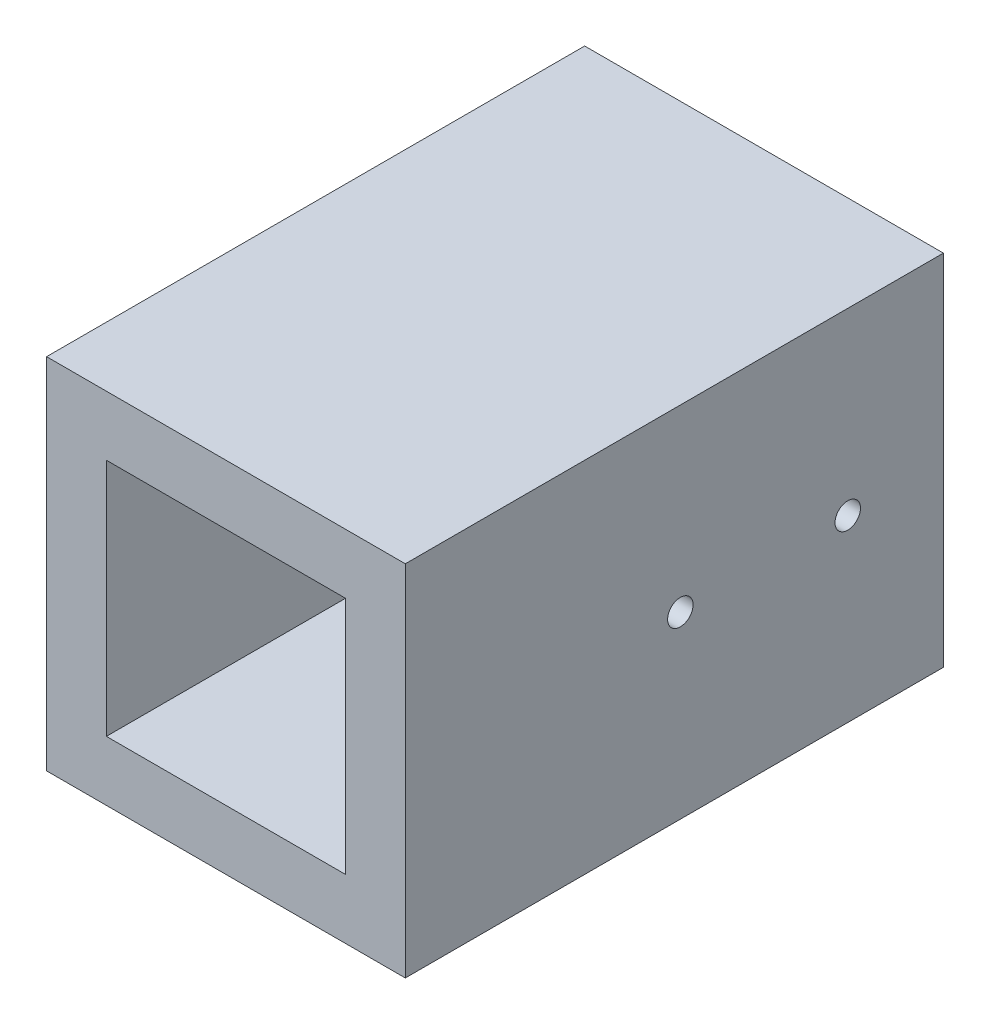
ISO-10303-21;
HEADER;
FILE_DESCRIPTION(('STEP AP214'),'2;1');
FILE_NAME('part.step','',(''),(''),'','','');
FILE_SCHEMA(('AUTOMOTIVE_DESIGN { 1 0 10303 214 1 1 1 1 }'));
ENDSEC;
DATA;
#1=APPLICATION_CONTEXT('core data for automotive mechanical design processes');
#2=APPLICATION_PROTOCOL_DEFINITION('international standard','automotive_design',2000,#1);
#3=PRODUCT_CONTEXT('',#1,'mechanical');
#4=PRODUCT('Part','Part','',(#3));
#5=PRODUCT_RELATED_PRODUCT_CATEGORY('part','',(#4));
#6=PRODUCT_DEFINITION_FORMATION('','',#4);
#7=PRODUCT_DEFINITION_CONTEXT('part definition',#1,'design');
#8=PRODUCT_DEFINITION('design','',#6,#7);
#9=PRODUCT_DEFINITION_SHAPE('','',#8);
#10=(LENGTH_UNIT() NAMED_UNIT(*) SI_UNIT(.MILLI.,.METRE.));
#11=(NAMED_UNIT(*) PLANE_ANGLE_UNIT() SI_UNIT($,.RADIAN.));
#12=(NAMED_UNIT(*) SI_UNIT($,.STERADIAN.) SOLID_ANGLE_UNIT());
#13=UNCERTAINTY_MEASURE_WITH_UNIT(LENGTH_MEASURE(1.E-05),#10,'distance_accuracy_value','');
#14=(GEOMETRIC_REPRESENTATION_CONTEXT(3) GLOBAL_UNCERTAINTY_ASSIGNED_CONTEXT((#13)) GLOBAL_UNIT_ASSIGNED_CONTEXT((#10,
#11,#12)) REPRESENTATION_CONTEXT('',''));
#15=CARTESIAN_POINT('',(0.,0.,0.));
#16=DIRECTION('',(0.,0.,1.));
#17=DIRECTION('',(1.,0.,0.));
#18=AXIS2_PLACEMENT_3D('',#15,#16,#17);
#19=CARTESIAN_POINT('',(19.05,-19.05,76.2));
#20=DIRECTION('',(-1.,0.,0.));
#21=DIRECTION('',(0.,0.,1.));
#22=AXIS2_PLACEMENT_3D('',#19,#20,#21);
#23=PLANE('',#22);
#24=DIRECTION('',(0.,0.,-1.));
#25=VECTOR('',#24,1.);
#26=CARTESIAN_POINT('',(19.05,-19.05,76.2));
#27=LINE('',#26,#25);
#28=CARTESIAN_POINT('',(19.05,-19.05,76.2));
#29=VERTEX_POINT('',#28);
#30=CARTESIAN_POINT('',(19.05,-19.05,19.05));
#31=VERTEX_POINT('',#30);
#32=EDGE_CURVE('E50',#29,#31,#27,.T.);
#33=ORIENTED_EDGE('',*,*,#32,.T.);
#34=DIRECTION('',(0.,-1.,0.));
#35=VECTOR('',#34,1.);
#36=CARTESIAN_POINT('',(19.05,-19.05,19.05));
#37=LINE('',#36,#35);
#38=CARTESIAN_POINT('',(19.05,19.05,19.05));
#39=VERTEX_POINT('',#38);
#40=EDGE_CURVE('E155',#39,#31,#37,.T.);
#41=ORIENTED_EDGE('',*,*,#40,.F.);
#42=DIRECTION('',(0.,0.,-1.));
#43=VECTOR('',#42,1.);
#44=CARTESIAN_POINT('',(19.05,19.05,76.2));
#45=LINE('',#44,#43);
#46=CARTESIAN_POINT('',(19.05,19.05,76.2));
#47=VERTEX_POINT('',#46);
#48=EDGE_CURVE('E146',#47,#39,#45,.T.);
#49=ORIENTED_EDGE('',*,*,#48,.F.);
#50=DIRECTION('',(0.,1.,0.));
#51=VECTOR('',#50,1.);
#52=CARTESIAN_POINT('',(19.05,-19.05,76.2));
#53=LINE('',#52,#51);
#54=EDGE_CURVE('E139',#29,#47,#53,.T.);
#55=ORIENTED_EDGE('',*,*,#54,.F.);
#56=EDGE_LOOP('',(#33,#41,#49,#55));
#57=FACE_BOUND('',#56,.T.);
#58=CARTESIAN_POINT('',(19.05,0.,46.99));
#59=DIRECTION('',(1.,0.,0.));
#60=DIRECTION('',(0.,0.,-1.));
#61=AXIS2_PLACEMENT_3D('',#58,#59,#60);
#62=CIRCLE('',#61,1.35254999999999);
#63=CARTESIAN_POINT('',(19.05,0.,45.63745));
#64=VERTEX_POINT('',#63);
#65=EDGE_CURVE('E300',#64,#64,#62,.T.);
#66=ORIENTED_EDGE('',*,*,#65,.F.);
#67=EDGE_LOOP('',(#66));
#68=FACE_BOUND('',#67,.T.);
#69=CARTESIAN_POINT('',(19.05,0.,29.21));
#70=DIRECTION('',(1.,0.,0.));
#71=DIRECTION('',(0.,0.,-1.));
#72=AXIS2_PLACEMENT_3D('',#69,#70,#71);
#73=CIRCLE('',#72,1.35254999999999);
#74=CARTESIAN_POINT('',(19.05,0.,27.85745));
#75=VERTEX_POINT('',#74);
#76=EDGE_CURVE('E296',#75,#75,#73,.T.);
#77=ORIENTED_EDGE('',*,*,#76,.F.);
#78=EDGE_LOOP('',(#77));
#79=FACE_BOUND('',#78,.T.);
#80=ADVANCED_FACE('F42',(#57,#68,#79),#23,.F.);
#81=CARTESIAN_POINT('',(0.,0.,76.2));
#82=DIRECTION('',(0.,0.,1.));
#83=DIRECTION('',(1.,0.,0.));
#84=AXIS2_PLACEMENT_3D('',#81,#82,#83);
#85=PLANE('',#84);
#86=DIRECTION('',(0.,-1.,0.));
#87=VECTOR('',#86,1.);
#88=CARTESIAN_POINT('',(-19.05,19.05,76.2));
#89=LINE('',#88,#87);
#90=CARTESIAN_POINT('',(-19.05,19.05,76.2));
#91=VERTEX_POINT('',#90);
#92=CARTESIAN_POINT('',(-19.05,-19.05,76.2));
#93=VERTEX_POINT('',#92);
#94=EDGE_CURVE('E129',#91,#93,#89,.T.);
#95=ORIENTED_EDGE('',*,*,#94,.T.);
#96=DIRECTION('',(1.,0.,0.));
#97=VECTOR('',#96,1.);
#98=CARTESIAN_POINT('',(-19.05,-19.05,76.2));
#99=LINE('',#98,#97);
#100=EDGE_CURVE('E137',#93,#29,#99,.T.);
#101=ORIENTED_EDGE('',*,*,#100,.T.);
#102=ORIENTED_EDGE('',*,*,#54,.T.);
#103=DIRECTION('',(-1.,0.,0.));
#104=VECTOR('',#103,1.);
#105=CARTESIAN_POINT('',(19.05,19.05,76.2));
#106=LINE('',#105,#104);
#107=EDGE_CURVE('E141',#47,#91,#106,.T.);
#108=ORIENTED_EDGE('',*,*,#107,.T.);
#109=EDGE_LOOP('',(#95,#101,#102,#108));
#110=FACE_BOUND('',#109,.T.);
#111=DIRECTION('',(1.,0.,0.));
#112=VECTOR('',#111,1.);
#113=CARTESIAN_POINT('',(-12.7,-12.7,76.2));
#114=LINE('',#113,#112);
#115=CARTESIAN_POINT('',(-12.7,-12.7,76.2));
#116=VERTEX_POINT('',#115);
#117=CARTESIAN_POINT('',(12.7000000000001,-12.7,76.2));
#118=VERTEX_POINT('',#117);
#119=EDGE_CURVE('E126',#116,#118,#114,.T.);
#120=ORIENTED_EDGE('',*,*,#119,.F.);
#121=DIRECTION('',(0.,-1.,0.));
#122=VECTOR('',#121,1.);
#123=CARTESIAN_POINT('',(-12.7,12.7,76.2));
#124=LINE('',#123,#122);
#125=CARTESIAN_POINT('',(-12.7,12.7,76.2));
#126=VERTEX_POINT('',#125);
#127=EDGE_CURVE('E169',#126,#116,#124,.T.);
#128=ORIENTED_EDGE('',*,*,#127,.F.);
#129=DIRECTION('',(-1.,0.,0.));
#130=VECTOR('',#129,1.);
#131=CARTESIAN_POINT('',(12.7000000000001,12.7,76.2));
#132=LINE('',#131,#130);
#133=CARTESIAN_POINT('',(12.7000000000001,12.7,76.2));
#134=VERTEX_POINT('',#133);
#135=EDGE_CURVE('E174',#134,#126,#132,.T.);
#136=ORIENTED_EDGE('',*,*,#135,.F.);
#137=DIRECTION('',(0.,1.,0.));
#138=VECTOR('',#137,1.);
#139=CARTESIAN_POINT('',(12.7000000000001,-12.7,76.2));
#140=LINE('',#139,#138);
#141=EDGE_CURVE('E172',#118,#134,#140,.T.);
#142=ORIENTED_EDGE('',*,*,#141,.F.);
#143=EDGE_LOOP('',(#120,#128,#136,#142));
#144=FACE_BOUND('',#143,.T.);
#145=ADVANCED_FACE('F184',(#110,#144),#85,.T.);
#146=CARTESIAN_POINT('',(-19.05,19.05,76.2));
#147=DIRECTION('',(1.,0.,0.));
#148=DIRECTION('',(0.,0.,-1.));
#149=AXIS2_PLACEMENT_3D('',#146,#147,#148);
#150=PLANE('',#149);
#151=CARTESIAN_POINT('',(-19.05,0.,39.37));
#152=DIRECTION('',(-1.,0.,0.));
#153=DIRECTION('',(0.,0.,1.));
#154=AXIS2_PLACEMENT_3D('',#151,#152,#153);
#155=CIRCLE('',#154,3.80999999999998);
#156=CARTESIAN_POINT('',(-19.05,0.,43.1799999999999));
#157=VERTEX_POINT('',#156);
#158=EDGE_CURVE('E122',#157,#157,#155,.T.);
#159=ORIENTED_EDGE('',*,*,#158,.F.);
#160=EDGE_LOOP('',(#159));
#161=FACE_BOUND('',#160,.T.);
#162=DIRECTION('',(0.,0.,-1.));
#163=VECTOR('',#162,1.);
#164=CARTESIAN_POINT('',(-19.05,19.05,76.2));
#165=LINE('',#164,#163);
#166=CARTESIAN_POINT('',(-19.05,19.05,19.05));
#167=VERTEX_POINT('',#166);
#168=EDGE_CURVE('E143',#91,#167,#165,.T.);
#169=ORIENTED_EDGE('',*,*,#168,.T.);
#170=DIRECTION('',(0.,1.,0.));
#171=VECTOR('',#170,1.);
#172=CARTESIAN_POINT('',(-19.05,19.05,19.05));
#173=LINE('',#172,#171);
#174=CARTESIAN_POINT('',(-19.05,-19.05,19.05));
#175=VERTEX_POINT('',#174);
#176=EDGE_CURVE('E57',#175,#167,#173,.T.);
#177=ORIENTED_EDGE('',*,*,#176,.F.);
#178=DIRECTION('',(0.,0.,-1.));
#179=VECTOR('',#178,1.);
#180=CARTESIAN_POINT('',(-19.05,-19.05,76.2));
#181=LINE('',#180,#179);
#182=EDGE_CURVE('E11',#93,#175,#181,.T.);
#183=ORIENTED_EDGE('',*,*,#182,.F.);
#184=ORIENTED_EDGE('',*,*,#94,.F.);
#185=EDGE_LOOP('',(#169,#177,#183,#184));
#186=FACE_BOUND('',#185,.T.);
#187=ADVANCED_FACE('F44',(#161,#186),#150,.F.);
#188=CARTESIAN_POINT('',(-19.05,-19.05,76.2));
#189=DIRECTION('',(0.,1.,0.));
#190=DIRECTION('',(0.,0.,1.));
#191=AXIS2_PLACEMENT_3D('',#188,#189,#190);
#192=PLANE('',#191);
#193=ORIENTED_EDGE('',*,*,#182,.T.);
#194=DIRECTION('',(-1.,0.,0.));
#195=VECTOR('',#194,1.);
#196=CARTESIAN_POINT('',(-19.05,-19.05,19.05));
#197=LINE('',#196,#195);
#198=EDGE_CURVE('E159',#31,#175,#197,.T.);
#199=ORIENTED_EDGE('',*,*,#198,.F.);
#200=ORIENTED_EDGE('',*,*,#32,.F.);
#201=ORIENTED_EDGE('',*,*,#100,.F.);
#202=EDGE_LOOP('',(#193,#199,#200,#201));
#203=FACE_BOUND('',#202,.T.);
#204=ADVANCED_FACE('F158',(#203),#192,.F.);
#205=CARTESIAN_POINT('',(19.05,19.05,76.2));
#206=DIRECTION('',(0.,-1.,0.));
#207=DIRECTION('',(1.,0.,0.));
#208=AXIS2_PLACEMENT_3D('',#205,#206,#207);
#209=PLANE('',#208);
#210=ORIENTED_EDGE('',*,*,#48,.T.);
#211=DIRECTION('',(1.,0.,0.));
#212=VECTOR('',#211,1.);
#213=CARTESIAN_POINT('',(19.05,19.05,19.05));
#214=LINE('',#213,#212);
#215=EDGE_CURVE('E162',#167,#39,#214,.T.);
#216=ORIENTED_EDGE('',*,*,#215,.F.);
#217=ORIENTED_EDGE('',*,*,#168,.F.);
#218=ORIENTED_EDGE('',*,*,#107,.F.);
#219=EDGE_LOOP('',(#210,#216,#217,#218));
#220=FACE_BOUND('',#219,.T.);
#221=ADVANCED_FACE('F198',(#220),#209,.F.);
#222=CARTESIAN_POINT('',(-12.7,12.7,76.2));
#223=DIRECTION('',(1.,0.,0.));
#224=DIRECTION('',(0.,0.,-1.));
#225=AXIS2_PLACEMENT_3D('',#222,#223,#224);
#226=PLANE('',#225);
#227=CARTESIAN_POINT('',(-12.7,0.,39.37));
#228=DIRECTION('',(1.,0.,0.));
#229=DIRECTION('',(0.,0.,-1.));
#230=AXIS2_PLACEMENT_3D('',#227,#228,#229);
#231=CIRCLE('',#230,3.80999999999998);
#232=CARTESIAN_POINT('',(-12.7,0.,35.56));
#233=VERTEX_POINT('',#232);
#234=EDGE_CURVE('E309',#233,#233,#231,.F.);
#235=ORIENTED_EDGE('',*,*,#234,.T.);
#236=EDGE_LOOP('',(#235));
#237=FACE_BOUND('',#236,.T.);
#238=DIRECTION('',(0.,1.,0.));
#239=VECTOR('',#238,1.);
#240=CARTESIAN_POINT('',(-12.7,12.7,19.05));
#241=LINE('',#240,#239);
#242=CARTESIAN_POINT('',(-12.7,-12.7,19.05));
#243=VERTEX_POINT('',#242);
#244=CARTESIAN_POINT('',(-12.7,12.7,19.05));
#245=VERTEX_POINT('',#244);
#246=EDGE_CURVE('E108',#243,#245,#241,.T.);
#247=ORIENTED_EDGE('',*,*,#246,.T.);
#248=DIRECTION('',(0.,0.,-1.));
#249=VECTOR('',#248,1.);
#250=CARTESIAN_POINT('',(-12.7,12.7,76.2));
#251=LINE('',#250,#249);
#252=EDGE_CURVE('E131',#126,#245,#251,.T.);
#253=ORIENTED_EDGE('',*,*,#252,.F.);
#254=ORIENTED_EDGE('',*,*,#127,.T.);
#255=DIRECTION('',(0.,0.,-1.));
#256=VECTOR('',#255,1.);
#257=CARTESIAN_POINT('',(-12.7,-12.7,76.2));
#258=LINE('',#257,#256);
#259=EDGE_CURVE('E127',#116,#243,#258,.T.);
#260=ORIENTED_EDGE('',*,*,#259,.T.);
#261=EDGE_LOOP('',(#247,#253,#254,#260));
#262=FACE_BOUND('',#261,.T.);
#263=ADVANCED_FACE('F182',(#237,#262),#226,.T.);
#264=CARTESIAN_POINT('',(-12.7,-12.7,76.2));
#265=DIRECTION('',(0.,1.,0.));
#266=DIRECTION('',(0.,0.,1.));
#267=AXIS2_PLACEMENT_3D('',#264,#265,#266);
#268=PLANE('',#267);
#269=DIRECTION('',(-1.,0.,0.));
#270=VECTOR('',#269,1.);
#271=CARTESIAN_POINT('',(-12.7,-12.7,19.05));
#272=LINE('',#271,#270);
#273=CARTESIAN_POINT('',(12.7000000000001,-12.7,19.05));
#274=VERTEX_POINT('',#273);
#275=EDGE_CURVE('E105',#274,#243,#272,.T.);
#276=ORIENTED_EDGE('',*,*,#275,.T.);
#277=ORIENTED_EDGE('',*,*,#259,.F.);
#278=ORIENTED_EDGE('',*,*,#119,.T.);
#279=DIRECTION('',(0.,0.,-1.));
#280=VECTOR('',#279,1.);
#281=CARTESIAN_POINT('',(12.7000000000001,-12.7,76.2));
#282=LINE('',#281,#280);
#283=EDGE_CURVE('E119',#118,#274,#282,.T.);
#284=ORIENTED_EDGE('',*,*,#283,.T.);
#285=EDGE_LOOP('',(#276,#277,#278,#284));
#286=FACE_BOUND('',#285,.T.);
#287=ADVANCED_FACE('F124',(#286),#268,.T.);
#288=CARTESIAN_POINT('',(12.7000000000001,-12.7,76.2));
#289=DIRECTION('',(-1.,0.,0.));
#290=DIRECTION('',(0.,0.,1.));
#291=AXIS2_PLACEMENT_3D('',#288,#289,#290);
#292=PLANE('',#291);
#293=CARTESIAN_POINT('',(12.7000000000001,0.,29.21));
#294=DIRECTION('',(-1.,0.,0.));
#295=DIRECTION('',(0.,0.,1.));
#296=AXIS2_PLACEMENT_3D('',#293,#294,#295);
#297=CIRCLE('',#296,1.35254999999999);
#298=CARTESIAN_POINT('',(12.7000000000001,0.,30.56255));
#299=VERTEX_POINT('',#298);
#300=EDGE_CURVE('E299',#299,#299,#297,.T.);
#301=ORIENTED_EDGE('',*,*,#300,.F.);
#302=EDGE_LOOP('',(#301));
#303=FACE_BOUND('',#302,.T.);
#304=CARTESIAN_POINT('',(12.7000000000001,0.,46.99));
#305=DIRECTION('',(-1.,0.,0.));
#306=DIRECTION('',(0.,0.,1.));
#307=AXIS2_PLACEMENT_3D('',#304,#305,#306);
#308=CIRCLE('',#307,1.35254999999999);
#309=CARTESIAN_POINT('',(12.7000000000001,0.,48.34255));
#310=VERTEX_POINT('',#309);
#311=EDGE_CURVE('E303',#310,#310,#308,.T.);
#312=ORIENTED_EDGE('',*,*,#311,.F.);
#313=EDGE_LOOP('',(#312));
#314=FACE_BOUND('',#313,.T.);
#315=DIRECTION('',(0.,-1.,0.));
#316=VECTOR('',#315,1.);
#317=CARTESIAN_POINT('',(12.7000000000001,-12.7,19.05));
#318=LINE('',#317,#316);
#319=CARTESIAN_POINT('',(12.7000000000001,12.7,19.05));
#320=VERTEX_POINT('',#319);
#321=EDGE_CURVE('E65',#320,#274,#318,.T.);
#322=ORIENTED_EDGE('',*,*,#321,.T.);
#323=ORIENTED_EDGE('',*,*,#283,.F.);
#324=ORIENTED_EDGE('',*,*,#141,.T.);
#325=DIRECTION('',(0.,0.,-1.));
#326=VECTOR('',#325,1.);
#327=CARTESIAN_POINT('',(12.7000000000001,12.7,76.2));
#328=LINE('',#327,#326);
#329=EDGE_CURVE('E121',#134,#320,#328,.T.);
#330=ORIENTED_EDGE('',*,*,#329,.T.);
#331=EDGE_LOOP('',(#322,#323,#324,#330));
#332=FACE_BOUND('',#331,.T.);
#333=ADVANCED_FACE('F117',(#303,#314,#332),#292,.T.);
#334=CARTESIAN_POINT('',(12.7000000000001,12.7,76.2));
#335=DIRECTION('',(0.,-1.,0.));
#336=DIRECTION('',(0.,0.,-1.));
#337=AXIS2_PLACEMENT_3D('',#334,#335,#336);
#338=PLANE('',#337);
#339=DIRECTION('',(1.,0.,0.));
#340=VECTOR('',#339,1.);
#341=CARTESIAN_POINT('',(12.7000000000001,12.7,19.05));
#342=LINE('',#341,#340);
#343=EDGE_CURVE('E164',#245,#320,#342,.T.);
#344=ORIENTED_EDGE('',*,*,#343,.T.);
#345=ORIENTED_EDGE('',*,*,#329,.F.);
#346=ORIENTED_EDGE('',*,*,#135,.T.);
#347=ORIENTED_EDGE('',*,*,#252,.T.);
#348=EDGE_LOOP('',(#344,#345,#346,#347));
#349=FACE_BOUND('',#348,.T.);
#350=ADVANCED_FACE('F178',(#349),#338,.T.);
#351=CARTESIAN_POINT('',(0.,0.,19.05));
#352=DIRECTION('',(0.,0.,1.));
#353=DIRECTION('',(1.,0.,0.));
#354=AXIS2_PLACEMENT_3D('',#351,#352,#353);
#355=PLANE('',#354);
#356=ORIENTED_EDGE('',*,*,#321,.F.);
#357=ORIENTED_EDGE('',*,*,#343,.F.);
#358=ORIENTED_EDGE('',*,*,#246,.F.);
#359=ORIENTED_EDGE('',*,*,#275,.F.);
#360=EDGE_LOOP('',(#356,#357,#358,#359));
#361=FACE_BOUND('',#360,.T.);
#362=ORIENTED_EDGE('',*,*,#40,.T.);
#363=ORIENTED_EDGE('',*,*,#198,.T.);
#364=ORIENTED_EDGE('',*,*,#176,.T.);
#365=ORIENTED_EDGE('',*,*,#215,.T.);
#366=EDGE_LOOP('',(#362,#363,#364,#365));
#367=FACE_BOUND('',#366,.T.);
#368=ADVANCED_FACE('F106',(#361,#367),#355,.F.);
#369=CARTESIAN_POINT('',(19.051,0.,39.37));
#370=DIRECTION('',(-1.,0.,0.));
#371=DIRECTION('',(0.,0.,1.));
#372=AXIS2_PLACEMENT_3D('',#369,#370,#371);
#373=CYLINDRICAL_SURFACE('',#372,3.80999999999998);
#374=ORIENTED_EDGE('',*,*,#234,.F.);
#375=EDGE_LOOP('',(#374));
#376=FACE_BOUND('',#375,.T.);
#377=ORIENTED_EDGE('',*,*,#158,.T.);
#378=EDGE_LOOP('',(#377));
#379=FACE_BOUND('',#378,.T.);
#380=ADVANCED_FACE('F229',(#376,#379),#373,.F.);
#381=CARTESIAN_POINT('',(19.05,0.,46.99));
#382=DIRECTION('',(1.,0.,0.));
#383=DIRECTION('',(0.,0.,-1.));
#384=AXIS2_PLACEMENT_3D('',#381,#382,#383);
#385=CYLINDRICAL_SURFACE('',#384,1.35254999999999);
#386=ORIENTED_EDGE('',*,*,#65,.T.);
#387=EDGE_LOOP('',(#386));
#388=FACE_BOUND('',#387,.T.);
#389=ORIENTED_EDGE('',*,*,#311,.T.);
#390=EDGE_LOOP('',(#389));
#391=FACE_BOUND('',#390,.T.);
#392=ADVANCED_FACE('F247',(#388,#391),#385,.F.);
#393=CARTESIAN_POINT('',(19.05,0.,29.21));
#394=DIRECTION('',(1.,0.,0.));
#395=DIRECTION('',(0.,0.,-1.));
#396=AXIS2_PLACEMENT_3D('',#393,#394,#395);
#397=CYLINDRICAL_SURFACE('',#396,1.35254999999999);
#398=ORIENTED_EDGE('',*,*,#76,.T.);
#399=EDGE_LOOP('',(#398));
#400=FACE_BOUND('',#399,.T.);
#401=ORIENTED_EDGE('',*,*,#300,.T.);
#402=EDGE_LOOP('',(#401));
#403=FACE_BOUND('',#402,.T.);
#404=ADVANCED_FACE('F270',(#400,#403),#397,.F.);
#405=CLOSED_SHELL('',(#80,#145,#187,#204,#221,#263,#287,#333,#350,#368,#380,#392,#404));
#406=MANIFOLD_SOLID_BREP('B2',#405);
#407=ADVANCED_BREP_SHAPE_REPRESENTATION('',(#18,#406),#14);
#408=SHAPE_DEFINITION_REPRESENTATION(#9,#407);
ENDSEC;
END-ISO-10303-21;
